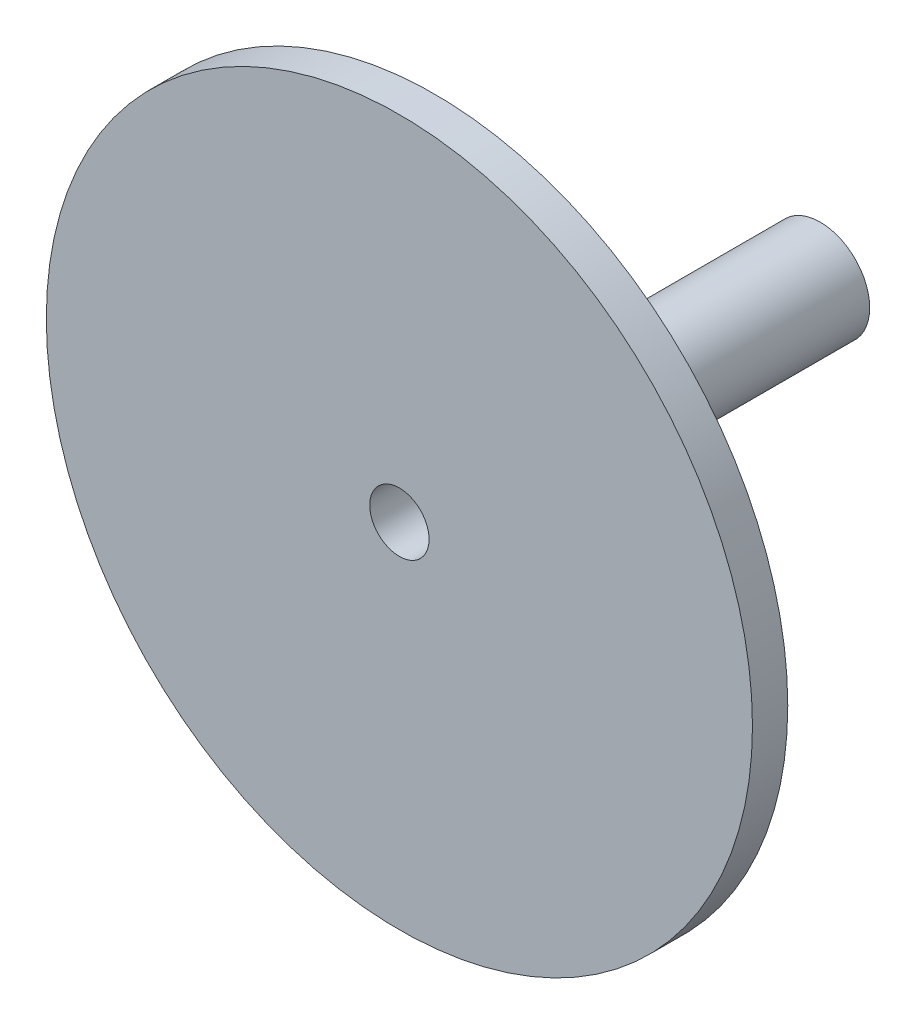
ISO-10303-21;
HEADER;
FILE_DESCRIPTION(('STEP AP214'),'2;1');
FILE_NAME('part.step','',(''),(''),'','','');
FILE_SCHEMA(('AUTOMOTIVE_DESIGN { 1 0 10303 214 1 1 1 1 }'));
ENDSEC;
DATA;
#1=APPLICATION_CONTEXT('core data for automotive mechanical design processes');
#2=APPLICATION_PROTOCOL_DEFINITION('international standard','automotive_design',2000,#1);
#3=PRODUCT_CONTEXT('',#1,'mechanical');
#4=PRODUCT('Part','Part','',(#3));
#5=PRODUCT_RELATED_PRODUCT_CATEGORY('part','',(#4));
#6=PRODUCT_DEFINITION_FORMATION('','',#4);
#7=PRODUCT_DEFINITION_CONTEXT('part definition',#1,'design');
#8=PRODUCT_DEFINITION('design','',#6,#7);
#9=PRODUCT_DEFINITION_SHAPE('','',#8);
#10=(LENGTH_UNIT() NAMED_UNIT(*) SI_UNIT(.MILLI.,.METRE.));
#11=(NAMED_UNIT(*) PLANE_ANGLE_UNIT() SI_UNIT($,.RADIAN.));
#12=(NAMED_UNIT(*) SI_UNIT($,.STERADIAN.) SOLID_ANGLE_UNIT());
#13=UNCERTAINTY_MEASURE_WITH_UNIT(LENGTH_MEASURE(1.E-05),#10,'distance_accuracy_value','');
#14=(GEOMETRIC_REPRESENTATION_CONTEXT(3) GLOBAL_UNCERTAINTY_ASSIGNED_CONTEXT((#13)) GLOBAL_UNIT_ASSIGNED_CONTEXT((#10,
#11,#12)) REPRESENTATION_CONTEXT('',''));
#15=CARTESIAN_POINT('',(0.,0.,0.));
#16=DIRECTION('',(0.,0.,1.));
#17=DIRECTION('',(1.,0.,0.));
#18=AXIS2_PLACEMENT_3D('',#15,#16,#17);
#19=CARTESIAN_POINT('',(0.,0.,37.846));
#20=DIRECTION('',(0.,0.,-1.));
#21=DIRECTION('',(-1.,0.,0.));
#22=AXIS2_PLACEMENT_3D('',#19,#20,#21);
#23=CYLINDRICAL_SURFACE('',#22,4.445);
#24=CARTESIAN_POINT('',(0.,0.,0.));
#25=DIRECTION('',(0.,0.,1.));
#26=DIRECTION('',(1.,0.,0.));
#27=AXIS2_PLACEMENT_3D('',#24,#25,#26);
#28=CIRCLE('',#27,4.445);
#29=CARTESIAN_POINT('',(4.445,0.,0.));
#30=VERTEX_POINT('',#29);
#31=EDGE_CURVE('E46',#30,#30,#28,.T.);
#32=ORIENTED_EDGE('',*,*,#31,.T.);
#33=EDGE_LOOP('',(#32));
#34=FACE_BOUND('',#33,.T.);
#35=CARTESIAN_POINT('',(0.,0.,34.671));
#36=DIRECTION('',(0.,0.,1.));
#37=DIRECTION('',(1.,0.,0.));
#38=AXIS2_PLACEMENT_3D('',#35,#36,#37);
#39=CIRCLE('',#38,4.445);
#40=CARTESIAN_POINT('',(4.445,0.,34.671));
#41=VERTEX_POINT('',#40);
#42=EDGE_CURVE('E11',#41,#41,#39,.T.);
#43=ORIENTED_EDGE('',*,*,#42,.F.);
#44=EDGE_LOOP('',(#43));
#45=FACE_BOUND('',#44,.T.);
#46=ADVANCED_FACE('F43',(#34,#45),#23,.T.);
#47=CARTESIAN_POINT('',(0.,0.,37.846));
#48=DIRECTION('',(0.,0.,1.));
#49=DIRECTION('',(1.,0.,0.));
#50=AXIS2_PLACEMENT_3D('',#47,#48,#49);
#51=PLANE('',#50);
#52=CARTESIAN_POINT('',(0.,0.,37.846));
#53=DIRECTION('',(0.,0.,1.));
#54=DIRECTION('',(1.,0.,0.));
#55=AXIS2_PLACEMENT_3D('',#52,#53,#54);
#56=CIRCLE('',#55,2.667);
#57=CARTESIAN_POINT('',(2.667,0.,37.846));
#58=VERTEX_POINT('',#57);
#59=EDGE_CURVE('E56',#58,#58,#56,.T.);
#60=ORIENTED_EDGE('',*,*,#59,.F.);
#61=EDGE_LOOP('',(#60));
#62=FACE_BOUND('',#61,.T.);
#63=CARTESIAN_POINT('',(0.,0.,37.846));
#64=DIRECTION('',(0.,0.,1.));
#65=DIRECTION('',(1.,0.,0.));
#66=AXIS2_PLACEMENT_3D('',#63,#64,#65);
#67=CIRCLE('',#66,31.75);
#68=CARTESIAN_POINT('',(31.75,0.,37.846));
#69=VERTEX_POINT('',#68);
#70=EDGE_CURVE('E59',#69,#69,#67,.T.);
#71=ORIENTED_EDGE('',*,*,#70,.T.);
#72=EDGE_LOOP('',(#71));
#73=FACE_BOUND('',#72,.T.);
#74=ADVANCED_FACE('F77',(#62,#73),#51,.T.);
#75=CARTESIAN_POINT('',(0.,0.,0.));
#76=DIRECTION('',(0.,0.,1.));
#77=DIRECTION('',(1.,0.,0.));
#78=AXIS2_PLACEMENT_3D('',#75,#76,#77);
#79=PLANE('',#78);
#80=ORIENTED_EDGE('',*,*,#31,.F.);
#81=EDGE_LOOP('',(#80));
#82=FACE_BOUND('',#81,.T.);
#83=CARTESIAN_POINT('',(0.,0.,0.));
#84=DIRECTION('',(0.,0.,1.));
#85=DIRECTION('',(1.,0.,0.));
#86=AXIS2_PLACEMENT_3D('',#83,#84,#85);
#87=CIRCLE('',#86,2.667);
#88=CARTESIAN_POINT('',(2.667,0.,0.));
#89=VERTEX_POINT('',#88);
#90=EDGE_CURVE('E63',#89,#89,#87,.T.);
#91=ORIENTED_EDGE('',*,*,#90,.T.);
#92=EDGE_LOOP('',(#91));
#93=FACE_BOUND('',#92,.T.);
#94=ADVANCED_FACE('F95',(#82,#93),#79,.F.);
#95=CARTESIAN_POINT('',(0.,0.,37.846));
#96=DIRECTION('',(0.,0.,-1.));
#97=DIRECTION('',(-1.,0.,0.));
#98=AXIS2_PLACEMENT_3D('',#95,#96,#97);
#99=CYLINDRICAL_SURFACE('',#98,2.667);
#100=ORIENTED_EDGE('',*,*,#59,.T.);
#101=EDGE_LOOP('',(#100));
#102=FACE_BOUND('',#101,.T.);
#103=ORIENTED_EDGE('',*,*,#90,.F.);
#104=EDGE_LOOP('',(#103));
#105=FACE_BOUND('',#104,.T.);
#106=ADVANCED_FACE('F86',(#102,#105),#99,.F.);
#107=CARTESIAN_POINT('',(0.,0.,34.671));
#108=DIRECTION('',(0.,0.,1.));
#109=DIRECTION('',(1.,0.,0.));
#110=AXIS2_PLACEMENT_3D('',#107,#108,#109);
#111=PLANE('',#110);
#112=CARTESIAN_POINT('',(0.,0.,34.671));
#113=DIRECTION('',(0.,0.,1.));
#114=DIRECTION('',(1.,0.,0.));
#115=AXIS2_PLACEMENT_3D('',#112,#113,#114);
#116=CIRCLE('',#115,31.75);
#117=CARTESIAN_POINT('',(31.75,0.,34.671));
#118=VERTEX_POINT('',#117);
#119=EDGE_CURVE('E66',#118,#118,#116,.T.);
#120=ORIENTED_EDGE('',*,*,#119,.F.);
#121=EDGE_LOOP('',(#120));
#122=FACE_BOUND('',#121,.T.);
#123=ORIENTED_EDGE('',*,*,#42,.T.);
#124=EDGE_LOOP('',(#123));
#125=FACE_BOUND('',#124,.T.);
#126=ADVANCED_FACE('F81',(#122,#125),#111,.F.);
#127=CARTESIAN_POINT('',(0.,0.,34.671));
#128=DIRECTION('',(0.,0.,1.));
#129=DIRECTION('',(1.,0.,0.));
#130=AXIS2_PLACEMENT_3D('',#127,#128,#129);
#131=CYLINDRICAL_SURFACE('',#130,31.75);
#132=ORIENTED_EDGE('',*,*,#119,.T.);
#133=EDGE_LOOP('',(#132));
#134=FACE_BOUND('',#133,.T.);
#135=ORIENTED_EDGE('',*,*,#70,.F.);
#136=EDGE_LOOP('',(#135));
#137=FACE_BOUND('',#136,.T.);
#138=ADVANCED_FACE('F79',(#134,#137),#131,.T.);
#139=CLOSED_SHELL('',(#46,#74,#94,#106,#126,#138));
#140=MANIFOLD_SOLID_BREP('B2',#139);
#141=ADVANCED_BREP_SHAPE_REPRESENTATION('',(#18,#140),#14);
#142=SHAPE_DEFINITION_REPRESENTATION(#9,#141);
ENDSEC;
END-ISO-10303-21;
